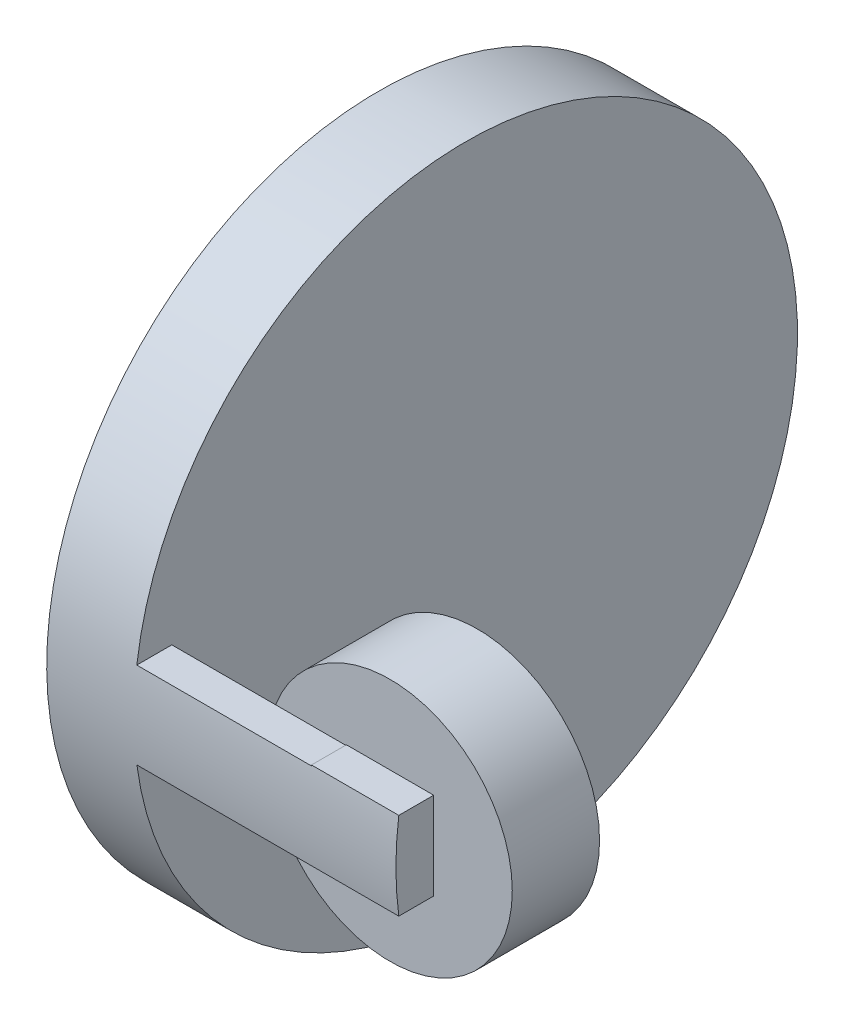
ISO-10303-21;
HEADER;
FILE_DESCRIPTION(('STEP AP214'),'2;1');
FILE_NAME('part.step','',(''),(''),'','','');
FILE_SCHEMA(('AUTOMOTIVE_DESIGN { 1 0 10303 214 1 1 1 1 }'));
ENDSEC;
DATA;
#1=APPLICATION_CONTEXT('core data for automotive mechanical design processes');
#2=APPLICATION_PROTOCOL_DEFINITION('international standard','automotive_design',2000,#1);
#3=PRODUCT_CONTEXT('',#1,'mechanical');
#4=PRODUCT('Part','Part','',(#3));
#5=PRODUCT_RELATED_PRODUCT_CATEGORY('part','',(#4));
#6=PRODUCT_DEFINITION_FORMATION('','',#4);
#7=PRODUCT_DEFINITION_CONTEXT('part definition',#1,'design');
#8=PRODUCT_DEFINITION('design','',#6,#7);
#9=PRODUCT_DEFINITION_SHAPE('','',#8);
#10=(LENGTH_UNIT() NAMED_UNIT(*) SI_UNIT(.MILLI.,.METRE.));
#11=(NAMED_UNIT(*) PLANE_ANGLE_UNIT() SI_UNIT($,.RADIAN.));
#12=(NAMED_UNIT(*) SI_UNIT($,.STERADIAN.) SOLID_ANGLE_UNIT());
#13=UNCERTAINTY_MEASURE_WITH_UNIT(LENGTH_MEASURE(1.E-05),#10,'distance_accuracy_value','');
#14=(GEOMETRIC_REPRESENTATION_CONTEXT(3) GLOBAL_UNCERTAINTY_ASSIGNED_CONTEXT((#13)) GLOBAL_UNIT_ASSIGNED_CONTEXT((#10,
#11,#12)) REPRESENTATION_CONTEXT('',''));
#15=CARTESIAN_POINT('',(0.,0.,0.));
#16=DIRECTION('',(0.,0.,1.));
#17=DIRECTION('',(1.,0.,0.));
#18=AXIS2_PLACEMENT_3D('',#15,#16,#17);
#19=CARTESIAN_POINT('',(0.,0.,10.));
#20=DIRECTION('',(0.,0.,1.));
#21=DIRECTION('',(1.,0.,0.));
#22=AXIS2_PLACEMENT_3D('',#19,#20,#21);
#23=PLANE('',#22);
#24=DIRECTION('',(1.,0.,0.));
#25=VECTOR('',#24,1.);
#26=CARTESIAN_POINT('',(-5.,-5.,10.));
#27=LINE('',#26,#25);
#28=CARTESIAN_POINT('',(-13.076696830622,-5.,10.));
#29=VERTEX_POINT('',#28);
#30=CARTESIAN_POINT('',(5.,-5.,10.));
#31=VERTEX_POINT('',#30);
#32=EDGE_CURVE('E151',#29,#31,#27,.T.);
#33=ORIENTED_EDGE('',*,*,#32,.F.);
#34=CARTESIAN_POINT('',(0.,0.,10.));
#35=DIRECTION('',(0.,0.,1.));
#36=DIRECTION('',(1.,0.,0.));
#37=AXIS2_PLACEMENT_3D('',#34,#35,#36);
#38=CIRCLE('',#37,14.);
#39=CARTESIAN_POINT('',(-13.1096817143984,4.91286528892942,10.));
#40=VERTEX_POINT('',#39);
#41=EDGE_CURVE('E169',#29,#40,#38,.T.);
#42=ORIENTED_EDGE('',*,*,#41,.T.);
#43=DIRECTION('',(1.,0.,0.));
#44=VECTOR('',#43,1.);
#45=CARTESIAN_POINT('',(-25.,4.91286528892942,10.));
#46=LINE('',#45,#44);
#47=CARTESIAN_POINT('',(-5.,4.91286528892942,10.));
#48=VERTEX_POINT('',#47);
#49=EDGE_CURVE('E136',#40,#48,#46,.T.);
#50=ORIENTED_EDGE('',*,*,#49,.T.);
#51=DIRECTION('',(0.,-1.,0.));
#52=VECTOR('',#51,1.);
#53=CARTESIAN_POINT('',(-5.,5.,10.));
#54=LINE('',#53,#52);
#55=CARTESIAN_POINT('',(-5.,5.,10.));
#56=VERTEX_POINT('',#55);
#57=EDGE_CURVE('E148',#56,#48,#54,.T.);
#58=ORIENTED_EDGE('',*,*,#57,.F.);
#59=DIRECTION('',(-1.,0.,0.));
#60=VECTOR('',#59,1.);
#61=CARTESIAN_POINT('',(-5.,5.,10.));
#62=LINE('',#61,#60);
#63=CARTESIAN_POINT('',(5.,5.,10.));
#64=VERTEX_POINT('',#63);
#65=EDGE_CURVE('E145',#64,#56,#62,.T.);
#66=ORIENTED_EDGE('',*,*,#65,.F.);
#67=DIRECTION('',(0.,1.,0.));
#68=VECTOR('',#67,1.);
#69=CARTESIAN_POINT('',(5.,5.,10.));
#70=LINE('',#69,#68);
#71=EDGE_CURVE('E143',#31,#64,#70,.T.);
#72=ORIENTED_EDGE('',*,*,#71,.F.);
#73=EDGE_LOOP('',(#33,#42,#50,#58,#66,#72));
#74=FACE_BOUND('',#73,.T.);
#75=ADVANCED_FACE('F34',(#74),#23,.T.);
#76=CARTESIAN_POINT('',(-5.,5.,18.));
#77=DIRECTION('',(1.,0.,0.));
#78=DIRECTION('',(0.,1.,0.));
#79=AXIS2_PLACEMENT_3D('',#76,#77,#78);
#80=PLANE('',#79);
#81=DIRECTION('',(0.,0.,-1.));
#82=VECTOR('',#81,1.);
#83=CARTESIAN_POINT('',(-5.,4.91286528892942,10.));
#84=LINE('',#83,#82);
#85=CARTESIAN_POINT('',(-5.,4.91286528892942,14.0114631277404));
#86=VERTEX_POINT('',#85);
#87=EDGE_CURVE('E133',#86,#48,#84,.T.);
#88=ORIENTED_EDGE('',*,*,#87,.F.);
#89=CARTESIAN_POINT('',(-5.,0.,-23.6696164036747));
#90=DIRECTION('',(1.,0.,0.));
#91=DIRECTION('',(0.,1.,0.));
#92=AXIS2_PLACEMENT_3D('',#89,#90,#91);
#93=CIRCLE('',#92,38.);
#94=CARTESIAN_POINT('',(-5.,5.,14.));
#95=VERTEX_POINT('',#94);
#96=EDGE_CURVE('E130',#86,#95,#93,.F.);
#97=ORIENTED_EDGE('',*,*,#96,.T.);
#98=DIRECTION('',(0.,0.,-1.));
#99=VECTOR('',#98,1.);
#100=CARTESIAN_POINT('',(-5.,5.,18.));
#101=LINE('',#100,#99);
#102=EDGE_CURVE('E154',#95,#56,#101,.T.);
#103=ORIENTED_EDGE('',*,*,#102,.T.);
#104=ORIENTED_EDGE('',*,*,#57,.T.);
#105=EDGE_LOOP('',(#88,#97,#103,#104));
#106=FACE_BOUND('',#105,.T.);
#107=ADVANCED_FACE('F186',(#106),#80,.F.);
#108=CARTESIAN_POINT('',(0.,0.,10.));
#109=DIRECTION('',(0.,0.,-1.));
#110=DIRECTION('',(-1.,0.,0.));
#111=AXIS2_PLACEMENT_3D('',#108,#109,#110);
#112=CYLINDRICAL_SURFACE('',#111,14.);
#113=EDGE_CURVE('E43',#40,#29,#38,.T.);
#114=ORIENTED_EDGE('',*,*,#113,.F.);
#115=ORIENTED_EDGE('',*,*,#41,.F.);
#116=EDGE_LOOP('',(#114,#115));
#117=FACE_BOUND('',#116,.T.);
#118=CARTESIAN_POINT('',(0.,0.,0.));
#119=DIRECTION('',(0.,0.,1.));
#120=DIRECTION('',(1.,0.,0.));
#121=AXIS2_PLACEMENT_3D('',#118,#119,#120);
#122=CIRCLE('',#121,14.);
#123=CARTESIAN_POINT('',(14.,0.,0.));
#124=VERTEX_POINT('',#123);
#125=EDGE_CURVE('E167',#124,#124,#122,.T.);
#126=ORIENTED_EDGE('',*,*,#125,.T.);
#127=EDGE_LOOP('',(#126));
#128=FACE_BOUND('',#127,.T.);
#129=ADVANCED_FACE('F36',(#117,#128),#112,.T.);
#130=CARTESIAN_POINT('',(0.,0.,0.));
#131=DIRECTION('',(0.,0.,1.));
#132=DIRECTION('',(1.,0.,0.));
#133=AXIS2_PLACEMENT_3D('',#130,#131,#132);
#134=PLANE('',#133);
#135=CARTESIAN_POINT('',(0.,0.,0.));
#136=DIRECTION('',(0.,0.,-1.));
#137=DIRECTION('',(-1.,0.,0.));
#138=AXIS2_PLACEMENT_3D('',#135,#136,#137);
#139=CIRCLE('',#138,5.);
#140=CARTESIAN_POINT('',(-5.,0.,0.));
#141=VERTEX_POINT('',#140);
#142=EDGE_CURVE('E158',#141,#141,#139,.T.);
#143=ORIENTED_EDGE('',*,*,#142,.F.);
#144=EDGE_LOOP('',(#143));
#145=FACE_BOUND('',#144,.T.);
#146=ORIENTED_EDGE('',*,*,#125,.F.);
#147=EDGE_LOOP('',(#146));
#148=FACE_BOUND('',#147,.T.);
#149=ADVANCED_FACE('F212',(#145,#148),#134,.F.);
#150=CARTESIAN_POINT('',(0.,0.,1.8));
#151=DIRECTION('',(0.,0.,-1.));
#152=DIRECTION('',(-1.,0.,0.));
#153=AXIS2_PLACEMENT_3D('',#150,#151,#152);
#154=PLANE('',#153);
#155=CARTESIAN_POINT('',(0.,0.,1.8));
#156=DIRECTION('',(0.,0.,-1.));
#157=DIRECTION('',(-1.,0.,0.));
#158=AXIS2_PLACEMENT_3D('',#155,#156,#157);
#159=CIRCLE('',#158,5.);
#160=CARTESIAN_POINT('',(-5.,0.,1.8));
#161=VERTEX_POINT('',#160);
#162=EDGE_CURVE('E159',#161,#161,#159,.T.);
#163=ORIENTED_EDGE('',*,*,#162,.T.);
#164=EDGE_LOOP('',(#163));
#165=FACE_BOUND('',#164,.T.);
#166=CARTESIAN_POINT('',(0.,0.,1.8));
#167=DIRECTION('',(0.,0.,-1.));
#168=DIRECTION('',(-1.,0.,0.));
#169=AXIS2_PLACEMENT_3D('',#166,#167,#168);
#170=CIRCLE('',#169,2.25);
#171=CARTESIAN_POINT('',(-2.25,0.,1.8));
#172=VERTEX_POINT('',#171);
#173=EDGE_CURVE('E38',#172,#172,#170,.F.);
#174=ORIENTED_EDGE('',*,*,#173,.T.);
#175=EDGE_LOOP('',(#174));
#176=FACE_BOUND('',#175,.T.);
#177=ADVANCED_FACE('F214',(#165,#176),#154,.T.);
#178=CARTESIAN_POINT('',(0.,0.,1.8));
#179=DIRECTION('',(0.,0.,-1.));
#180=DIRECTION('',(-1.,0.,0.));
#181=AXIS2_PLACEMENT_3D('',#178,#179,#180);
#182=CYLINDRICAL_SURFACE('',#181,5.);
#183=ORIENTED_EDGE('',*,*,#162,.F.);
#184=EDGE_LOOP('',(#183));
#185=FACE_BOUND('',#184,.T.);
#186=ORIENTED_EDGE('',*,*,#142,.T.);
#187=EDGE_LOOP('',(#186));
#188=FACE_BOUND('',#187,.T.);
#189=ADVANCED_FACE('F220',(#185,#188),#182,.F.);
#190=CARTESIAN_POINT('',(0.,0.,5.));
#191=DIRECTION('',(0.,0.,-1.));
#192=DIRECTION('',(-1.,0.,0.));
#193=AXIS2_PLACEMENT_3D('',#190,#191,#192);
#194=PLANE('',#193);
#195=CARTESIAN_POINT('',(0.,0.,5.));
#196=DIRECTION('',(0.,0.,-1.));
#197=DIRECTION('',(-1.,0.,0.));
#198=AXIS2_PLACEMENT_3D('',#195,#196,#197);
#199=CIRCLE('',#198,2.25);
#200=CARTESIAN_POINT('',(-2.25,0.,5.));
#201=VERTEX_POINT('',#200);
#202=EDGE_CURVE('E164',#201,#201,#199,.T.);
#203=ORIENTED_EDGE('',*,*,#202,.T.);
#204=EDGE_LOOP('',(#203));
#205=FACE_BOUND('',#204,.T.);
#206=ADVANCED_FACE('F201',(#205),#194,.T.);
#207=CARTESIAN_POINT('',(0.,0.,5.));
#208=DIRECTION('',(0.,0.,-1.));
#209=DIRECTION('',(-1.,0.,0.));
#210=AXIS2_PLACEMENT_3D('',#207,#208,#209);
#211=CYLINDRICAL_SURFACE('',#210,2.25);
#212=ORIENTED_EDGE('',*,*,#202,.F.);
#213=EDGE_LOOP('',(#212));
#214=FACE_BOUND('',#213,.T.);
#215=ORIENTED_EDGE('',*,*,#173,.F.);
#216=EDGE_LOOP('',(#215));
#217=FACE_BOUND('',#216,.T.);
#218=ADVANCED_FACE('F194',(#214,#217),#211,.F.);
#219=CARTESIAN_POINT('',(5.,5.,18.));
#220=DIRECTION('',(-1.,0.,0.));
#221=DIRECTION('',(0.,-1.,0.));
#222=AXIS2_PLACEMENT_3D('',#219,#220,#221);
#223=PLANE('',#222);
#224=DIRECTION('',(0.,0.,-1.));
#225=VECTOR('',#224,1.);
#226=CARTESIAN_POINT('',(5.,5.,18.));
#227=LINE('',#226,#225);
#228=CARTESIAN_POINT('',(5.,5.,14.));
#229=VERTEX_POINT('',#228);
#230=EDGE_CURVE('E156',#229,#64,#227,.T.);
#231=ORIENTED_EDGE('',*,*,#230,.F.);
#232=CARTESIAN_POINT('',(5.,0.,-23.6696164036747));
#233=DIRECTION('',(-1.,0.,0.));
#234=DIRECTION('',(0.,-1.,0.));
#235=AXIS2_PLACEMENT_3D('',#232,#233,#234);
#236=CIRCLE('',#235,38.);
#237=CARTESIAN_POINT('',(5.,-5.,14.));
#238=VERTEX_POINT('',#237);
#239=EDGE_CURVE('E104',#238,#229,#236,.T.);
#240=ORIENTED_EDGE('',*,*,#239,.F.);
#241=DIRECTION('',(0.,0.,-1.));
#242=VECTOR('',#241,1.);
#243=CARTESIAN_POINT('',(5.,-5.,18.));
#244=LINE('',#243,#242);
#245=EDGE_CURVE('E59',#238,#31,#244,.T.);
#246=ORIENTED_EDGE('',*,*,#245,.T.);
#247=ORIENTED_EDGE('',*,*,#71,.T.);
#248=EDGE_LOOP('',(#231,#240,#246,#247));
#249=FACE_BOUND('',#248,.T.);
#250=ADVANCED_FACE('F192',(#249),#223,.F.);
#251=CARTESIAN_POINT('',(-5.,5.,18.));
#252=DIRECTION('',(0.,-1.,0.));
#253=DIRECTION('',(0.,0.,-1.));
#254=AXIS2_PLACEMENT_3D('',#251,#252,#253);
#255=PLANE('',#254);
#256=ORIENTED_EDGE('',*,*,#102,.F.);
#257=DIRECTION('',(1.,0.,0.));
#258=VECTOR('',#257,1.);
#259=CARTESIAN_POINT('',(-25.,5.,14.));
#260=LINE('',#259,#258);
#261=EDGE_CURVE('E103',#95,#229,#260,.T.);
#262=ORIENTED_EDGE('',*,*,#261,.T.);
#263=ORIENTED_EDGE('',*,*,#230,.T.);
#264=ORIENTED_EDGE('',*,*,#65,.T.);
#265=EDGE_LOOP('',(#256,#262,#263,#264));
#266=FACE_BOUND('',#265,.T.);
#267=ADVANCED_FACE('F190',(#266),#255,.F.);
#268=CARTESIAN_POINT('',(-5.,-5.,18.));
#269=DIRECTION('',(0.,1.,0.));
#270=DIRECTION('',(0.,0.,1.));
#271=AXIS2_PLACEMENT_3D('',#268,#269,#270);
#272=PLANE('',#271);
#273=ORIENTED_EDGE('',*,*,#245,.F.);
#274=DIRECTION('',(1.,0.,0.));
#275=VECTOR('',#274,1.);
#276=CARTESIAN_POINT('',(-25.,-5.,14.));
#277=LINE('',#276,#275);
#278=CARTESIAN_POINT('',(-25.,-5.,14.));
#279=VERTEX_POINT('',#278);
#280=EDGE_CURVE('E96',#279,#238,#277,.T.);
#281=ORIENTED_EDGE('',*,*,#280,.F.);
#282=DIRECTION('',(0.,0.,1.));
#283=VECTOR('',#282,1.);
#284=CARTESIAN_POINT('',(-25.,-5.,10.));
#285=LINE('',#284,#283);
#286=CARTESIAN_POINT('',(-25.,-5.,10.));
#287=VERTEX_POINT('',#286);
#288=EDGE_CURVE('E100',#287,#279,#285,.T.);
#289=ORIENTED_EDGE('',*,*,#288,.F.);
#290=DIRECTION('',(1.,0.,0.));
#291=VECTOR('',#290,1.);
#292=CARTESIAN_POINT('',(-25.,-5.,10.));
#293=LINE('',#292,#291);
#294=EDGE_CURVE('E141',#287,#29,#293,.T.);
#295=ORIENTED_EDGE('',*,*,#294,.T.);
#296=ORIENTED_EDGE('',*,*,#32,.T.);
#297=EDGE_LOOP('',(#273,#281,#289,#295,#296));
#298=FACE_BOUND('',#297,.T.);
#299=ADVANCED_FACE('F98',(#298),#272,.F.);
#300=CARTESIAN_POINT('',(-25.,4.91286528892942,10.));
#301=DIRECTION('',(0.,0.,1.));
#302=DIRECTION('',(1.,0.,0.));
#303=AXIS2_PLACEMENT_3D('',#300,#301,#302);
#304=PLANE('',#303);
#305=CARTESIAN_POINT('',(-25.,4.91286528892942,10.));
#306=VERTEX_POINT('',#305);
#307=EDGE_CURVE('E138',#306,#40,#46,.T.);
#308=ORIENTED_EDGE('',*,*,#307,.T.);
#309=ORIENTED_EDGE('',*,*,#113,.T.);
#310=ORIENTED_EDGE('',*,*,#294,.F.);
#311=DIRECTION('',(0.,-1.,0.));
#312=VECTOR('',#311,1.);
#313=CARTESIAN_POINT('',(-25.,4.91286528892942,10.));
#314=LINE('',#313,#312);
#315=EDGE_CURVE('E113',#306,#287,#314,.T.);
#316=ORIENTED_EDGE('',*,*,#315,.F.);
#317=EDGE_LOOP('',(#308,#309,#310,#316));
#318=FACE_BOUND('',#317,.T.);
#319=ADVANCED_FACE('F181',(#318),#304,.F.);
#320=CARTESIAN_POINT('',(-25.,4.91286528892942,10.));
#321=DIRECTION('',(0.,-1.,0.));
#322=DIRECTION('',(1.,0.,0.));
#323=AXIS2_PLACEMENT_3D('',#320,#321,#322);
#324=PLANE('',#323);
#325=DIRECTION('',(0.,0.,-1.));
#326=VECTOR('',#325,1.);
#327=CARTESIAN_POINT('',(-25.,4.91286528892942,10.));
#328=LINE('',#327,#326);
#329=CARTESIAN_POINT('',(-25.,4.91286528892942,14.0114631277404));
#330=VERTEX_POINT('',#329);
#331=EDGE_CURVE('E114',#330,#306,#328,.T.);
#332=ORIENTED_EDGE('',*,*,#331,.F.);
#333=DIRECTION('',(1.,0.,0.));
#334=VECTOR('',#333,1.);
#335=CARTESIAN_POINT('',(-25.,4.91286528892942,14.0114631277404));
#336=LINE('',#335,#334);
#337=EDGE_CURVE('E51',#330,#86,#336,.T.);
#338=ORIENTED_EDGE('',*,*,#337,.T.);
#339=ORIENTED_EDGE('',*,*,#87,.T.);
#340=ORIENTED_EDGE('',*,*,#49,.F.);
#341=ORIENTED_EDGE('',*,*,#307,.F.);
#342=EDGE_LOOP('',(#332,#338,#339,#340,#341));
#343=FACE_BOUND('',#342,.T.);
#344=ADVANCED_FACE('F183',(#343),#324,.F.);
#345=CARTESIAN_POINT('',(-25.,0.,-23.6696164036747));
#346=DIRECTION('',(1.,0.,0.));
#347=DIRECTION('',(0.,1.,0.));
#348=AXIS2_PLACEMENT_3D('',#345,#346,#347);
#349=CYLINDRICAL_SURFACE('',#348,38.);
#350=ORIENTED_EDGE('',*,*,#337,.F.);
#351=CARTESIAN_POINT('',(-25.,0.,-23.6696164036747));
#352=DIRECTION('',(-1.,0.,0.));
#353=DIRECTION('',(0.,-1.,0.));
#354=AXIS2_PLACEMENT_3D('',#351,#352,#353);
#355=CIRCLE('',#354,38.);
#356=EDGE_CURVE('E111',#330,#279,#355,.T.);
#357=ORIENTED_EDGE('',*,*,#356,.T.);
#358=ORIENTED_EDGE('',*,*,#280,.T.);
#359=ORIENTED_EDGE('',*,*,#239,.T.);
#360=ORIENTED_EDGE('',*,*,#261,.F.);
#361=ORIENTED_EDGE('',*,*,#96,.F.);
#362=EDGE_LOOP('',(#350,#357,#358,#359,#360,#361));
#363=FACE_BOUND('',#362,.T.);
#364=CARTESIAN_POINT('',(-35.,0.,-23.6696164036747));
#365=DIRECTION('',(-1.,0.,0.));
#366=DIRECTION('',(0.,-1.,0.));
#367=AXIS2_PLACEMENT_3D('',#364,#365,#366);
#368=CIRCLE('',#367,38.);
#369=CARTESIAN_POINT('',(-35.,-38.,-23.6696164036747));
#370=VERTEX_POINT('',#369);
#371=EDGE_CURVE('E118',#370,#370,#368,.T.);
#372=ORIENTED_EDGE('',*,*,#371,.F.);
#373=EDGE_LOOP('',(#372));
#374=FACE_BOUND('',#373,.T.);
#375=ADVANCED_FACE('F116',(#363,#374),#349,.T.);
#376=CARTESIAN_POINT('',(-25.,0.,-23.6696164036747));
#377=DIRECTION('',(-1.,0.,0.));
#378=DIRECTION('',(0.,-1.,0.));
#379=AXIS2_PLACEMENT_3D('',#376,#377,#378);
#380=PLANE('',#379);
#381=ORIENTED_EDGE('',*,*,#356,.F.);
#382=ORIENTED_EDGE('',*,*,#331,.T.);
#383=ORIENTED_EDGE('',*,*,#315,.T.);
#384=ORIENTED_EDGE('',*,*,#288,.T.);
#385=EDGE_LOOP('',(#381,#382,#383,#384));
#386=FACE_BOUND('',#385,.T.);
#387=ADVANCED_FACE('F109',(#386),#380,.F.);
#388=CARTESIAN_POINT('',(-35.,0.,-23.6696164036747));
#389=DIRECTION('',(-1.,0.,0.));
#390=DIRECTION('',(0.,-1.,0.));
#391=AXIS2_PLACEMENT_3D('',#388,#389,#390);
#392=PLANE('',#391);
#393=CARTESIAN_POINT('',(-35.,0.99287456993124,-23.6696164036747));
#394=DIRECTION('',(-1.,0.,0.));
#395=DIRECTION('',(0.,-1.,0.));
#396=AXIS2_PLACEMENT_3D('',#393,#394,#395);
#397=CIRCLE('',#396,29.);
#398=CARTESIAN_POINT('',(-35.,-28.0071254300688,-23.6696164036747));
#399=VERTEX_POINT('',#398);
#400=EDGE_CURVE('E11',#399,#399,#397,.T.);
#401=ORIENTED_EDGE('',*,*,#400,.F.);
#402=EDGE_LOOP('',(#401));
#403=FACE_BOUND('',#402,.T.);
#404=ORIENTED_EDGE('',*,*,#371,.T.);
#405=EDGE_LOOP('',(#404));
#406=FACE_BOUND('',#405,.T.);
#407=ADVANCED_FACE('F318',(#403,#406),#392,.T.);
#408=CARTESIAN_POINT('',(-40.,0.992874569931239,-23.6696164036747));
#409=DIRECTION('',(1.,0.,0.));
#410=DIRECTION('',(0.,1.,0.));
#411=AXIS2_PLACEMENT_3D('',#408,#409,#410);
#412=CYLINDRICAL_SURFACE('',#411,29.);
#413=CARTESIAN_POINT('',(-40.,0.992874569931239,-23.6696164036747));
#414=DIRECTION('',(-1.,0.,0.));
#415=DIRECTION('',(0.,-1.,0.));
#416=AXIS2_PLACEMENT_3D('',#413,#414,#415);
#417=CIRCLE('',#416,29.);
#418=CARTESIAN_POINT('',(-40.,-28.0071254300688,-23.6696164036747));
#419=VERTEX_POINT('',#418);
#420=EDGE_CURVE('E119',#419,#419,#417,.T.);
#421=ORIENTED_EDGE('',*,*,#420,.F.);
#422=EDGE_LOOP('',(#421));
#423=FACE_BOUND('',#422,.T.);
#424=ORIENTED_EDGE('',*,*,#400,.T.);
#425=EDGE_LOOP('',(#424));
#426=FACE_BOUND('',#425,.T.);
#427=ADVANCED_FACE('F327',(#423,#426),#412,.T.);
#428=CARTESIAN_POINT('',(-40.,0.992874569931239,-23.6696164036747));
#429=DIRECTION('',(-1.,0.,0.));
#430=DIRECTION('',(0.,-1.,0.));
#431=AXIS2_PLACEMENT_3D('',#428,#429,#430);
#432=PLANE('',#431);
#433=ORIENTED_EDGE('',*,*,#420,.T.);
#434=EDGE_LOOP('',(#433));
#435=FACE_BOUND('',#434,.T.);
#436=ADVANCED_FACE('F337',(#435),#432,.T.);
#437=CLOSED_SHELL('',(#75,#107,#129,#149,#177,#189,#206,#218,#250,#267,#299,#319,#344,#375,#387,
#407,#427,#436));
#438=MANIFOLD_SOLID_BREP('B2',#437);
#439=ADVANCED_BREP_SHAPE_REPRESENTATION('',(#18,#438),#14);
#440=SHAPE_DEFINITION_REPRESENTATION(#9,#439);
ENDSEC;
END-ISO-10303-21;
